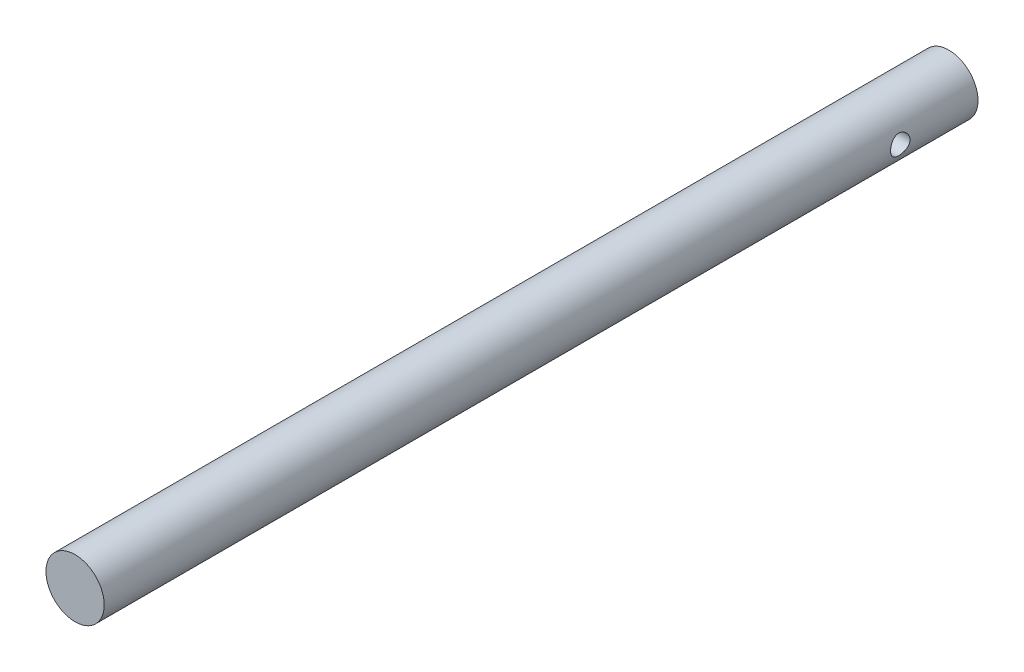
ISO-10303-21;
HEADER;
FILE_DESCRIPTION(('STEP AP214'),'2;1');
FILE_NAME('part.step','',(''),(''),'','','');
FILE_SCHEMA(('AUTOMOTIVE_DESIGN { 1 0 10303 214 1 1 1 1 }'));
ENDSEC;
DATA;
#1=APPLICATION_CONTEXT('core data for automotive mechanical design processes');
#2=APPLICATION_PROTOCOL_DEFINITION('international standard','automotive_design',2000,#1);
#3=PRODUCT_CONTEXT('',#1,'mechanical');
#4=PRODUCT('Part','Part','',(#3));
#5=PRODUCT_RELATED_PRODUCT_CATEGORY('part','',(#4));
#6=PRODUCT_DEFINITION_FORMATION('','',#4);
#7=PRODUCT_DEFINITION_CONTEXT('part definition',#1,'design');
#8=PRODUCT_DEFINITION('design','',#6,#7);
#9=PRODUCT_DEFINITION_SHAPE('','',#8);
#10=(LENGTH_UNIT() NAMED_UNIT(*) SI_UNIT(.MILLI.,.METRE.));
#11=(NAMED_UNIT(*) PLANE_ANGLE_UNIT() SI_UNIT($,.RADIAN.));
#12=(NAMED_UNIT(*) SI_UNIT($,.STERADIAN.) SOLID_ANGLE_UNIT());
#13=UNCERTAINTY_MEASURE_WITH_UNIT(LENGTH_MEASURE(1.E-05),#10,'distance_accuracy_value','');
#14=(GEOMETRIC_REPRESENTATION_CONTEXT(3) GLOBAL_UNCERTAINTY_ASSIGNED_CONTEXT((#13)) GLOBAL_UNIT_ASSIGNED_CONTEXT((#10,
#11,#12)) REPRESENTATION_CONTEXT('',''));
#15=CARTESIAN_POINT('',(0.,0.,0.));
#16=DIRECTION('',(0.,0.,1.));
#17=DIRECTION('',(1.,0.,0.));
#18=AXIS2_PLACEMENT_3D('',#15,#16,#17);
#19=CARTESIAN_POINT('',(0.,0.,15.));
#20=DIRECTION('',(0.,0.,-1.));
#21=DIRECTION('',(-1.,0.,0.));
#22=AXIS2_PLACEMENT_3D('',#19,#20,#21);
#23=CYLINDRICAL_SURFACE('',#22,4.5);
#24=CARTESIAN_POINT('',(4.5,0.,13.5));
#25=CARTESIAN_POINT('',(4.50000022951416,0.0818450443300849,13.5000003805975));
#26=CARTESIAN_POINT('',(4.49774654261317,0.163687791807825,13.4932796008092));
#27=CARTESIAN_POINT('',(4.48897815304921,0.324962641309459,13.4666563367742));
#28=CARTESIAN_POINT('',(4.48246300803229,0.404394492178227,13.4467524840766));
#29=CARTESIAN_POINT('',(4.46587961859664,0.558499184252664,13.3945211349239));
#30=CARTESIAN_POINT('',(4.4558173159628,0.633179738829051,13.3622144063111));
#31=CARTESIAN_POINT('',(4.43316668576013,0.776062405207987,13.2861882407425));
#32=CARTESIAN_POINT('',(4.42057786001667,0.844263235438059,13.2424665524961));
#33=CARTESIAN_POINT('',(4.39371141664507,0.9746125125334,13.1432612927119));
#34=CARTESIAN_POINT('',(4.37939334695677,1.03650555044746,13.0874531486093));
#35=CARTESIAN_POINT('',(4.35090472174682,1.15024903905313,12.9663492679402));
#36=CARTESIAN_POINT('',(4.33673419935823,1.20209727823419,12.9010514476072));
#37=CARTESIAN_POINT('',(4.30969998715911,1.29573741334179,12.7605223272053));
#38=CARTESIAN_POINT('',(4.29688558913532,1.33719728733155,12.6850593904018));
#39=CARTESIAN_POINT('',(4.27462958127902,1.40672831081658,12.5277358583122));
#40=CARTESIAN_POINT('',(4.26518694241118,1.43480354608015,12.4458772242559));
#41=CARTESIAN_POINT('',(4.25116954904066,1.47581019226375,12.2809901677549));
#42=CARTESIAN_POINT('',(4.24644143654417,1.48922017240765,12.1980941872664));
#43=CARTESIAN_POINT('',(4.24193484944261,1.50201168500172,12.0311043687662));
#44=CARTESIAN_POINT('',(4.24215484534095,1.50139755240708,11.9470109089362));
#45=CARTESIAN_POINT('',(4.2473852251227,1.48652985555513,11.784095054334));
#46=CARTESIAN_POINT('',(4.25217623801299,1.47290086975049,11.7052073956215));
#47=CARTESIAN_POINT('',(4.26564986586826,1.43340924427413,11.5509098705897));
#48=CARTESIAN_POINT('',(4.27433294676161,1.40754513988781,11.4755004218474));
#49=CARTESIAN_POINT('',(4.29476866696873,1.34390858709032,11.3288808756128));
#50=CARTESIAN_POINT('',(4.30656848689676,1.30595107306089,11.2577579617957));
#51=CARTESIAN_POINT('',(4.3318883786359,1.21933365945471,11.1226936375804));
#52=CARTESIAN_POINT('',(4.34540894685695,1.17067066854601,11.0587543095999));
#53=CARTESIAN_POINT('',(4.37350993751611,1.06102399902336,10.9363626027588));
#54=CARTESIAN_POINT('',(4.38810884032264,0.999529725114468,10.8783709582364));
#55=CARTESIAN_POINT('',(4.41610407580555,0.867509354955096,10.7734031000049));
#56=CARTESIAN_POINT('',(4.42950029307101,0.796982393491222,10.7264279427533));
#57=CARTESIAN_POINT('',(4.4537566190669,0.647921419569401,10.6444555496474));
#58=CARTESIAN_POINT('',(4.46459025012059,0.569314914624505,10.6095817629889));
#59=CARTESIAN_POINT('',(4.48230850716652,0.406903625046762,10.5536952390664));
#60=CARTESIAN_POINT('',(4.48919450482319,0.323100657232431,10.5326776868648));
#61=CARTESIAN_POINT('',(4.49801440607161,0.156575744293956,10.5059165009665));
#62=CARTESIAN_POINT('',(4.50015002750592,0.0739643997972693,10.4995502862409));
#63=CARTESIAN_POINT('',(4.49983354042241,-0.0911626049403563,10.5004990103977));
#64=CARTESIAN_POINT('',(4.49738220629043,-0.173678278979476,10.5078116399698));
#65=CARTESIAN_POINT('',(4.48830037075656,-0.333779799456384,10.5354178616039));
#66=CARTESIAN_POINT('',(4.48179298066788,-0.411439210252266,10.5553293090742));
#67=CARTESIAN_POINT('',(4.46537770245105,-0.562283937869361,10.6070901667001));
#68=CARTESIAN_POINT('',(4.45546938070013,-0.635468682762911,10.6389410992017));
#69=CARTESIAN_POINT('',(4.43293396930935,-0.777432444589911,10.7146056477612));
#70=CARTESIAN_POINT('',(4.42024222133679,-0.846044938825721,10.7587118899248));
#71=CARTESIAN_POINT('',(4.39357880874394,-0.975097245203381,10.8572912250202));
#72=CARTESIAN_POINT('',(4.37960675390741,-1.03553455169337,10.9117674840476));
#73=CARTESIAN_POINT('',(4.35115271970667,-1.14937876170945,11.0324681265099));
#74=CARTESIAN_POINT('',(4.33667641631142,-1.20234145386866,11.0991138403903));
#75=CARTESIAN_POINT('',(4.30949959942063,-1.29638628348536,11.2406573517163));
#76=CARTESIAN_POINT('',(4.29679910073003,-1.33746832189652,11.3155552179511));
#77=CARTESIAN_POINT('',(4.27473587687075,-1.40639539562454,11.4715095229348));
#78=CARTESIAN_POINT('',(4.26536641189468,-1.43426719824753,11.5525531187531));
#79=CARTESIAN_POINT('',(4.25116248459674,-1.47584200013903,11.7185679750662));
#80=CARTESIAN_POINT('',(4.24632597935459,-1.48955138243091,11.8035374481065));
#81=CARTESIAN_POINT('',(4.24196788311266,-1.50191442371601,11.9702956440614));
#82=CARTESIAN_POINT('',(4.24218600386123,-1.5013053859626,12.0520235104302));
#83=CARTESIAN_POINT('',(4.24726904735801,-1.48686344017304,12.2141476123831));
#84=CARTESIAN_POINT('',(4.25213369354042,-1.47303131918788,12.2945439269326));
#85=CARTESIAN_POINT('',(4.26576786457337,-1.43305771969402,12.4502034945037));
#86=CARTESIAN_POINT('',(4.27446147033716,-1.40715501902327,12.5255352375067));
#87=CARTESIAN_POINT('',(4.29474598227703,-1.34396904863962,12.6708411104074));
#88=CARTESIAN_POINT('',(4.3063375314509,-1.30668325283071,12.740814046782));
#89=CARTESIAN_POINT('',(4.33174243839069,-1.21989103887514,12.8767255048844));
#90=CARTESIAN_POINT('',(4.34563067463206,-1.16992236414687,12.9423547528476));
#91=CARTESIAN_POINT('',(4.37375034424879,-1.05996432470347,13.0645347200763));
#92=CARTESIAN_POINT('',(4.38798187368559,-0.999972126677223,13.1210828635321));
#93=CARTESIAN_POINT('',(4.41585045788316,-0.868862335381033,13.2257166184338));
#94=CARTESIAN_POINT('',(4.42944272701885,-0.797402270249594,13.2733865216265));
#95=CARTESIAN_POINT('',(4.45388986758918,-0.647036036109938,13.355985643276));
#96=CARTESIAN_POINT('',(4.46474543861895,-0.568131777198523,13.3909181188831));
#97=CARTESIAN_POINT('',(4.48208272602813,-0.408740470801463,13.445582448733));
#98=CARTESIAN_POINT('',(4.48873818633784,-0.328481636514612,13.4659236993951));
#99=CARTESIAN_POINT('',(4.49769610596333,-0.16548062401537,13.4931304210157));
#100=CARTESIAN_POINT('',(4.49999976797857,-0.0827391383531192,13.4999996152448));
#101=CARTESIAN_POINT('',(4.5,0.,13.5));
#102=B_SPLINE_CURVE_WITH_KNOTS('',3,(#24,#25,#26,#27,#28,#29,#30,#31,#32,#33,#34,#35,#36,#37,
#38,#39,#40,#41,#42,#43,#44,#45,#46,#47,#48,#49,#50,#51,#52,#53,#54,#55,#56,#57,#58,#59,#60,#61,
#62,#63,#64,#65,#66,#67,#68,#69,#70,#71,#72,#73,#74,#75,#76,#77,#78,#79,#80,#81,#82,#83,#84,#85,
#86,#87,#88,#89,#90,#91,#92,#93,#94,#95,#96,#97,#98,#99,#100,#101),.UNSPECIFIED.,.T.,.F.,(4,2,2,
2,2,2,2,2,2,2,2,2,2,2,2,2,2,2,2,2,2,2,2,2,2,2,2,2,2,2,2,2,2,2,2,2,2,2,4),(0.,0.245230659039017,
0.490486777901281,0.735334009305411,0.98022956669865,1.23277026424134,1.48536649931295,
1.74522577235206,2.0050056703925,2.2560288861276,2.50697450981228,2.7464523982692,
2.98595896283223,3.22932256732696,3.47275653837311,3.7288995871705,3.98506718949928,
4.24377608475536,4.50239503315813,4.74980374762755,4.99717069746265,5.2373723696732,
5.47760467926156,5.72415599765605,5.97078271232837,6.22861534321128,6.48645012352495,
6.74376020740156,7.0009542705876,7.24493499096387,7.48890119027063,7.72823380620627,
7.96761957263967,8.21745100037707,8.46735316685669,8.72699491252651,8.98657021728685,
9.23454837560721,9.4824579905721),.UNSPECIFIED.);
#103=CARTESIAN_POINT('',(4.5,0.,13.5));
#104=VERTEX_POINT('',#103);
#105=EDGE_CURVE('E35',#104,#104,#102,.T.);
#106=ORIENTED_EDGE('',*,*,#105,.T.);
#107=EDGE_LOOP('',(#106));
#108=FACE_BOUND('',#107,.T.);
#109=CARTESIAN_POINT('',(0.,0.,0.));
#110=DIRECTION('',(0.,0.,1.));
#111=DIRECTION('',(1.,0.,0.));
#112=AXIS2_PLACEMENT_3D('',#109,#110,#111);
#113=CIRCLE('',#112,4.5);
#114=CARTESIAN_POINT('',(4.5,0.,0.));
#115=VERTEX_POINT('',#114);
#116=EDGE_CURVE('E10',#115,#115,#113,.T.);
#117=ORIENTED_EDGE('',*,*,#116,.T.);
#118=EDGE_LOOP('',(#117));
#119=FACE_BOUND('',#118,.T.);
#120=CARTESIAN_POINT('',(-4.5,0.,10.5));
#121=CARTESIAN_POINT('',(-4.50000022951416,-0.0818450443300849,10.4999996194025));
#122=CARTESIAN_POINT('',(-4.49774654261317,-0.163687791807825,10.5067203991908));
#123=CARTESIAN_POINT('',(-4.48897815304921,-0.324962641309459,10.5333436632258));
#124=CARTESIAN_POINT('',(-4.48246300803229,-0.404394492178227,10.5532475159234));
#125=CARTESIAN_POINT('',(-4.46587961859664,-0.558499184252664,10.6054788650761));
#126=CARTESIAN_POINT('',(-4.4558173159628,-0.633179738829051,10.6377855936889));
#127=CARTESIAN_POINT('',(-4.43316668576013,-0.776062405207987,10.7138117592575));
#128=CARTESIAN_POINT('',(-4.42057786001667,-0.844263235438059,10.7575334475039));
#129=CARTESIAN_POINT('',(-4.39371141664507,-0.9746125125334,10.8567387072881));
#130=CARTESIAN_POINT('',(-4.37939334695677,-1.03650555044746,10.9125468513907));
#131=CARTESIAN_POINT('',(-4.35090472174682,-1.15024903905313,11.0336507320598));
#132=CARTESIAN_POINT('',(-4.33673419935823,-1.20209727823419,11.0989485523928));
#133=CARTESIAN_POINT('',(-4.30969998715911,-1.29573741334179,11.2394776727947));
#134=CARTESIAN_POINT('',(-4.29688558913532,-1.33719728733155,11.3149406095982));
#135=CARTESIAN_POINT('',(-4.27462958127902,-1.40672831081658,11.4722641416878));
#136=CARTESIAN_POINT('',(-4.26518694241118,-1.43480354608015,11.5541227757441));
#137=CARTESIAN_POINT('',(-4.25116954904066,-1.47581019226375,11.7190098322451));
#138=CARTESIAN_POINT('',(-4.24644143654417,-1.48922017240765,11.8019058127336));
#139=CARTESIAN_POINT('',(-4.24193484944261,-1.50201168500172,11.9688956312338));
#140=CARTESIAN_POINT('',(-4.24215484534095,-1.50139755240708,12.0529890910638));
#141=CARTESIAN_POINT('',(-4.2473852251227,-1.48652985555513,12.215904945666));
#142=CARTESIAN_POINT('',(-4.25217623801299,-1.47290086975049,12.2947926043785));
#143=CARTESIAN_POINT('',(-4.26564986586826,-1.43340924427413,12.4490901294103));
#144=CARTESIAN_POINT('',(-4.27433294676161,-1.40754513988781,12.5244995781526));
#145=CARTESIAN_POINT('',(-4.29476866696873,-1.34390858709032,12.6711191243872));
#146=CARTESIAN_POINT('',(-4.30656848689676,-1.30595107306089,12.7422420382043));
#147=CARTESIAN_POINT('',(-4.3318883786359,-1.21933365945471,12.8773063624196));
#148=CARTESIAN_POINT('',(-4.34540894685695,-1.17067066854601,12.9412456904001));
#149=CARTESIAN_POINT('',(-4.37350993751611,-1.06102399902336,13.0636373972412));
#150=CARTESIAN_POINT('',(-4.38810884032264,-0.999529725114468,13.1216290417636));
#151=CARTESIAN_POINT('',(-4.41610407580555,-0.867509354955096,13.2265968999951));
#152=CARTESIAN_POINT('',(-4.42950029307101,-0.796982393491222,13.2735720572467));
#153=CARTESIAN_POINT('',(-4.4537566190669,-0.647921419569401,13.3555444503526));
#154=CARTESIAN_POINT('',(-4.46459025012059,-0.569314914624505,13.3904182370111));
#155=CARTESIAN_POINT('',(-4.48230850716652,-0.406903625046762,13.4463047609336));
#156=CARTESIAN_POINT('',(-4.48919450482319,-0.323100657232431,13.4673223131352));
#157=CARTESIAN_POINT('',(-4.49801440607161,-0.156575744293956,13.4940834990335));
#158=CARTESIAN_POINT('',(-4.50015002750592,-0.0739643997972693,13.5004497137591));
#159=CARTESIAN_POINT('',(-4.49983354042241,0.0911626049403563,13.4995009896023));
#160=CARTESIAN_POINT('',(-4.49738220629043,0.173678278979476,13.4921883600302));
#161=CARTESIAN_POINT('',(-4.48830037075656,0.333779799456384,13.4645821383961));
#162=CARTESIAN_POINT('',(-4.48179298066788,0.411439210252266,13.4446706909258));
#163=CARTESIAN_POINT('',(-4.46537770245105,0.562283937869361,13.3929098332999));
#164=CARTESIAN_POINT('',(-4.45546938070013,0.635468682762911,13.3610589007983));
#165=CARTESIAN_POINT('',(-4.43293396930935,0.77743244458991,13.2853943522388));
#166=CARTESIAN_POINT('',(-4.42024222133679,0.84604493882572,13.2412881100752));
#167=CARTESIAN_POINT('',(-4.39357880874394,0.97509724520338,13.1427087749798));
#168=CARTESIAN_POINT('',(-4.37960675390741,1.03553455169337,13.0882325159524));
#169=CARTESIAN_POINT('',(-4.35115271970667,1.14937876170945,12.9675318734901));
#170=CARTESIAN_POINT('',(-4.33667641631142,1.20234145386866,12.9008861596097));
#171=CARTESIAN_POINT('',(-4.30949959942063,1.29638628348536,12.7593426482837));
#172=CARTESIAN_POINT('',(-4.29679910073003,1.33746832189652,12.6844447820489));
#173=CARTESIAN_POINT('',(-4.27473587687075,1.40639539562454,12.5284904770652));
#174=CARTESIAN_POINT('',(-4.26536641189468,1.43426719824753,12.4474468812469));
#175=CARTESIAN_POINT('',(-4.25116248459674,1.47584200013903,12.2814320249338));
#176=CARTESIAN_POINT('',(-4.24632597935459,1.48955138243091,12.1964625518935));
#177=CARTESIAN_POINT('',(-4.24196788311266,1.50191442371601,12.0297043559386));
#178=CARTESIAN_POINT('',(-4.24218600386123,1.5013053859626,11.9479764895698));
#179=CARTESIAN_POINT('',(-4.24726904735801,1.48686344017304,11.7858523876169));
#180=CARTESIAN_POINT('',(-4.25213369354042,1.47303131918788,11.7054560730674));
#181=CARTESIAN_POINT('',(-4.26576786457337,1.43305771969402,11.5497965054963));
#182=CARTESIAN_POINT('',(-4.27446147033716,1.40715501902327,11.4744647624933));
#183=CARTESIAN_POINT('',(-4.29474598227703,1.34396904863962,11.3291588895926));
#184=CARTESIAN_POINT('',(-4.3063375314509,1.30668325283071,11.259185953218));
#185=CARTESIAN_POINT('',(-4.33174243839069,1.21989103887514,11.1232744951156));
#186=CARTESIAN_POINT('',(-4.34563067463205,1.16992236414687,11.0576452471524));
#187=CARTESIAN_POINT('',(-4.37375034424879,1.05996432470347,10.9354652799237));
#188=CARTESIAN_POINT('',(-4.38798187368558,0.999972126677223,10.8789171364679));
#189=CARTESIAN_POINT('',(-4.41585045788316,0.868862335381033,10.7742833815662));
#190=CARTESIAN_POINT('',(-4.42944272701885,0.797402270249594,10.7266134783735));
#191=CARTESIAN_POINT('',(-4.45388986758918,0.647036036109938,10.644014356724));
#192=CARTESIAN_POINT('',(-4.46474543861895,0.568131777198523,10.6090818811169));
#193=CARTESIAN_POINT('',(-4.48208272602813,0.408740470801463,10.554417551267));
#194=CARTESIAN_POINT('',(-4.48873818633784,0.328481636514612,10.5340763006049));
#195=CARTESIAN_POINT('',(-4.49769610596333,0.16548062401537,10.5068695789843));
#196=CARTESIAN_POINT('',(-4.49999976797857,0.0827391383531192,10.5000003847552));
#197=CARTESIAN_POINT('',(-4.5,0.,10.5));
#198=B_SPLINE_CURVE_WITH_KNOTS('',3,(#120,#121,#122,#123,#124,#125,#126,#127,#128,#129,#130,
#131,#132,#133,#134,#135,#136,#137,#138,#139,#140,#141,#142,#143,#144,#145,#146,#147,#148,#149,
#150,#151,#152,#153,#154,#155,#156,#157,#158,#159,#160,#161,#162,#163,#164,#165,#166,#167,#168,
#169,#170,#171,#172,#173,#174,#175,#176,#177,#178,#179,#180,#181,#182,#183,#184,#185,#186,#187,
#188,#189,#190,#191,#192,#193,#194,#195,#196,#197),.UNSPECIFIED.,.T.,.F.,(4,2,2,2,2,2,2,2,2,2,2,
2,2,2,2,2,2,2,2,2,2,2,2,2,2,2,2,2,2,2,2,2,2,2,2,2,2,2,4),(0.,0.245230659039017,
0.490486777901281,0.735334009305411,0.98022956669865,1.23277026424134,1.48536649931295,
1.74522577235206,2.0050056703925,2.2560288861276,2.50697450981228,2.7464523982692,
2.98595896283223,3.22932256732696,3.47275653837311,3.7288995871705,3.98506718949928,
4.24377608475536,4.50239503315813,4.74980374762755,4.99717069746265,5.2373723696732,
5.47760467926156,5.72415599765605,5.97078271232837,6.22861534321128,6.48645012352495,
6.74376020740156,7.0009542705876,7.24493499096388,7.48890119027063,7.72823380620627,
7.96761957263967,8.21745100037707,8.46735316685669,8.72699491252651,8.98657021728685,
9.23454837560721,9.4824579905721),.UNSPECIFIED.);
#199=CARTESIAN_POINT('',(-4.5,0.,10.5));
#200=VERTEX_POINT('',#199);
#201=EDGE_CURVE('E39',#200,#200,#198,.T.);
#202=ORIENTED_EDGE('',*,*,#201,.F.);
#203=EDGE_LOOP('',(#202));
#204=FACE_BOUND('',#203,.T.);
#205=CARTESIAN_POINT('',(0.,0.,135.));
#206=DIRECTION('',(0.,0.,1.));
#207=DIRECTION('',(1.,0.,0.));
#208=AXIS2_PLACEMENT_3D('',#205,#206,#207);
#209=CIRCLE('',#208,4.5);
#210=CARTESIAN_POINT('',(4.5,0.,135.));
#211=VERTEX_POINT('',#210);
#212=EDGE_CURVE('E43',#211,#211,#209,.T.);
#213=ORIENTED_EDGE('',*,*,#212,.F.);
#214=EDGE_LOOP('',(#213));
#215=FACE_BOUND('',#214,.T.);
#216=ADVANCED_FACE('F29',(#108,#119,#204,#215),#23,.T.);
#217=CARTESIAN_POINT('',(0.,0.,0.));
#218=DIRECTION('',(0.,0.,1.));
#219=DIRECTION('',(1.,0.,0.));
#220=AXIS2_PLACEMENT_3D('',#217,#218,#219);
#221=PLANE('',#220);
#222=ORIENTED_EDGE('',*,*,#116,.F.);
#223=EDGE_LOOP('',(#222));
#224=FACE_BOUND('',#223,.T.);
#225=ADVANCED_FACE('F66',(#224),#221,.F.);
#226=CARTESIAN_POINT('',(4.501,0.,12.));
#227=DIRECTION('',(-1.,0.,0.));
#228=DIRECTION('',(0.,0.,1.));
#229=AXIS2_PLACEMENT_3D('',#226,#227,#228);
#230=CYLINDRICAL_SURFACE('',#229,1.5);
#231=ORIENTED_EDGE('',*,*,#105,.F.);
#232=EDGE_LOOP('',(#231));
#233=FACE_BOUND('',#232,.T.);
#234=ORIENTED_EDGE('',*,*,#201,.T.);
#235=EDGE_LOOP('',(#234));
#236=FACE_BOUND('',#235,.T.);
#237=ADVANCED_FACE('F54',(#233,#236),#230,.F.);
#238=CARTESIAN_POINT('',(0.,0.,135.));
#239=DIRECTION('',(0.,0.,1.));
#240=DIRECTION('',(1.,0.,0.));
#241=AXIS2_PLACEMENT_3D('',#238,#239,#240);
#242=PLANE('',#241);
#243=ORIENTED_EDGE('',*,*,#212,.T.);
#244=EDGE_LOOP('',(#243));
#245=FACE_BOUND('',#244,.T.);
#246=ADVANCED_FACE('F60',(#245),#242,.T.);
#247=CLOSED_SHELL('',(#216,#225,#237,#246));
#248=MANIFOLD_SOLID_BREP('B2',#247);
#249=ADVANCED_BREP_SHAPE_REPRESENTATION('',(#18,#248),#14);
#250=SHAPE_DEFINITION_REPRESENTATION(#9,#249);
ENDSEC;
END-ISO-10303-21;
